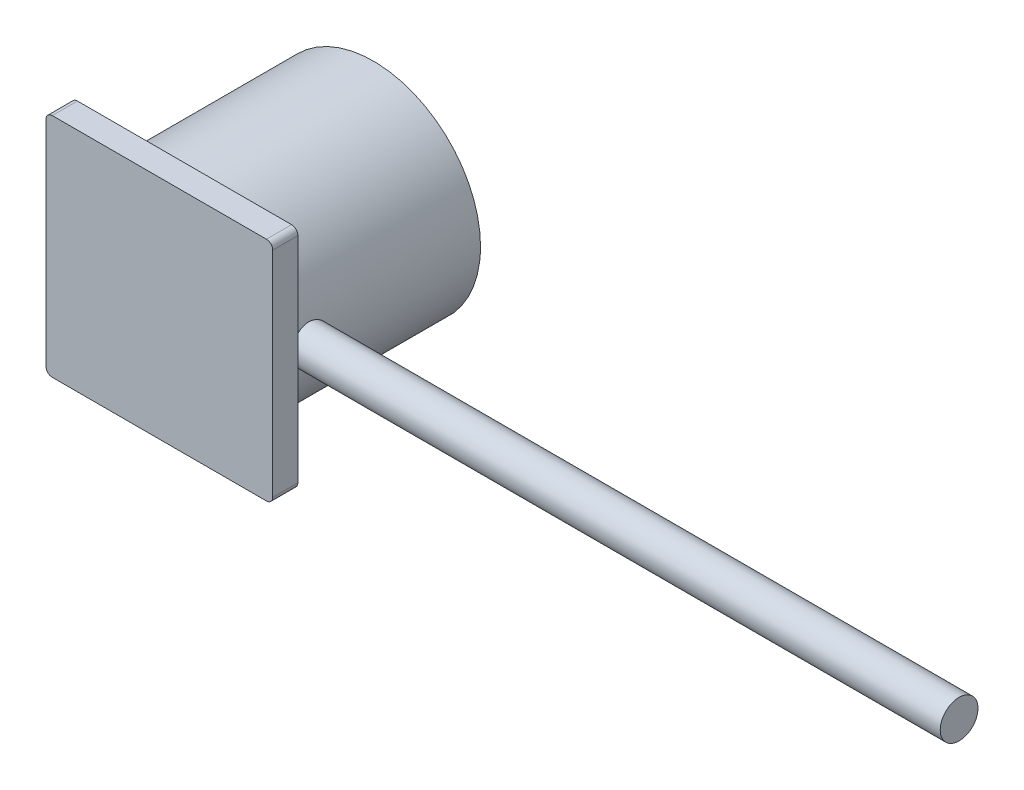
ISO-10303-21;
HEADER;
FILE_DESCRIPTION(('STEP AP214'),'2;1');
FILE_NAME('part.step','',(''),(''),'','','');
FILE_SCHEMA(('AUTOMOTIVE_DESIGN { 1 0 10303 214 1 1 1 1 }'));
ENDSEC;
DATA;
#1=APPLICATION_CONTEXT('core data for automotive mechanical design processes');
#2=APPLICATION_PROTOCOL_DEFINITION('international standard','automotive_design',2000,#1);
#3=PRODUCT_CONTEXT('',#1,'mechanical');
#4=PRODUCT('Part','Part','',(#3));
#5=PRODUCT_RELATED_PRODUCT_CATEGORY('part','',(#4));
#6=PRODUCT_DEFINITION_FORMATION('','',#4);
#7=PRODUCT_DEFINITION_CONTEXT('part definition',#1,'design');
#8=PRODUCT_DEFINITION('design','',#6,#7);
#9=PRODUCT_DEFINITION_SHAPE('','',#8);
#10=(LENGTH_UNIT() NAMED_UNIT(*) SI_UNIT(.MILLI.,.METRE.));
#11=(NAMED_UNIT(*) PLANE_ANGLE_UNIT() SI_UNIT($,.RADIAN.));
#12=(NAMED_UNIT(*) SI_UNIT($,.STERADIAN.) SOLID_ANGLE_UNIT());
#13=UNCERTAINTY_MEASURE_WITH_UNIT(LENGTH_MEASURE(1.E-05),#10,'distance_accuracy_value','');
#14=(GEOMETRIC_REPRESENTATION_CONTEXT(3) GLOBAL_UNCERTAINTY_ASSIGNED_CONTEXT((#13)) GLOBAL_UNIT_ASSIGNED_CONTEXT((#10,
#11,#12)) REPRESENTATION_CONTEXT('',''));
#15=CARTESIAN_POINT('',(0.,0.,0.));
#16=DIRECTION('',(0.,0.,1.));
#17=DIRECTION('',(1.,0.,0.));
#18=AXIS2_PLACEMENT_3D('',#15,#16,#17);
#19=CARTESIAN_POINT('',(0.,0.,150.));
#20=DIRECTION('',(0.,0.,-1.));
#21=DIRECTION('',(-1.,0.,0.));
#22=AXIS2_PLACEMENT_3D('',#19,#20,#21);
#23=CYLINDRICAL_SURFACE('',#22,85.);
#24=CARTESIAN_POINT('',(0.,0.,0.));
#25=DIRECTION('',(0.,0.,1.));
#26=DIRECTION('',(1.,0.,0.));
#27=AXIS2_PLACEMENT_3D('',#24,#25,#26);
#28=CIRCLE('',#27,85.);
#29=CARTESIAN_POINT('',(85.,0.,0.));
#30=VERTEX_POINT('',#29);
#31=EDGE_CURVE('E235',#30,#30,#28,.T.);
#32=ORIENTED_EDGE('',*,*,#31,.T.);
#33=EDGE_LOOP('',(#32));
#34=FACE_BOUND('',#33,.T.);
#35=CARTESIAN_POINT('',(84.2614977317636,-11.180339887499,145.));
#36=CARTESIAN_POINT('',(84.2243502648307,-11.4602820952851,144.68707508331));
#37=CARTESIAN_POINT('',(84.1875371233924,-11.7270459157408,144.36232298303));
#38=CARTESIAN_POINT('',(84.1155819518153,-12.232505619782,143.691482438714));
#39=CARTESIAN_POINT('',(84.0804399494977,-12.4712010361824,143.345393639685));
#40=CARTESIAN_POINT('',(84.0128345715087,-12.9187784992153,142.634247757288));
#41=CARTESIAN_POINT('',(83.9803708989801,-13.1276638517754,142.269192783398));
#42=CARTESIAN_POINT('',(83.9190443376802,-13.5141522129803,141.522603211806));
#43=CARTESIAN_POINT('',(83.8901813457556,-13.6917561178451,141.141069086626));
#44=CARTESIAN_POINT('',(83.8368666943744,-14.0145131329188,140.363827450858));
#45=CARTESIAN_POINT('',(83.812418820782,-14.1596384187133,139.968108121927));
#46=CARTESIAN_POINT('',(83.7686800101181,-14.4161435422095,139.165603353806));
#47=CARTESIAN_POINT('',(83.7493890135797,-14.5275237690472,138.758818042283));
#48=CARTESIAN_POINT('',(83.716540748055,-14.7156355859421,137.93727268097));
#49=CARTESIAN_POINT('',(83.7029809537239,-14.7923824375451,137.522516227913));
#50=CARTESIAN_POINT('',(83.6819864347215,-14.9106930324668,136.687864707694));
#51=CARTESIAN_POINT('',(83.674551621688,-14.9522572833489,136.267969714753));
#52=CARTESIAN_POINT('',(83.6660727531393,-14.9996280320312,135.43043682073));
#53=CARTESIAN_POINT('',(83.664963799073,-15.0057976558218,135.012820077559));
#54=CARTESIAN_POINT('',(83.6689953081647,-14.9833025224523,134.178557329718));
#55=CARTESIAN_POINT('',(83.6741357410667,-14.9546379339401,133.761911320358));
#56=CARTESIAN_POINT('',(83.6905167637252,-14.8626907930116,132.932501349713));
#57=CARTESIAN_POINT('',(83.7017584896061,-14.7994017931505,132.51973812601));
#58=CARTESIAN_POINT('',(83.7300143507846,-14.6386933138599,131.701113453106));
#59=CARTESIAN_POINT('',(83.74702848842,-14.5412738206075,131.295252006699));
#60=CARTESIAN_POINT('',(83.7862581015891,-14.3134984829811,130.494868703076));
#61=CARTESIAN_POINT('',(83.8084528874375,-14.1832734924245,130.100308571693));
#62=CARTESIAN_POINT('',(83.8574463307012,-13.8906688630187,129.323597601982));
#63=CARTESIAN_POINT('',(83.8842449698431,-13.7282893517952,128.941446714408));
#64=CARTESIAN_POINT('',(83.941689234473,-13.3725558093642,128.192155516565));
#65=CARTESIAN_POINT('',(83.9723348075703,-13.1792021999785,127.825015001963));
#66=CARTESIAN_POINT('',(84.03661749329,-12.7628861270812,127.108198571226));
#67=CARTESIAN_POINT('',(84.0702546390164,-12.539923335909,126.758522848419));
#68=CARTESIAN_POINT('',(84.1400213976509,-12.0629838898785,126.074736562434));
#69=CARTESIAN_POINT('',(84.1761767809472,-11.8086563948995,125.74087329764));
#70=CARTESIAN_POINT('',(84.2495850930538,-11.2729972972405,125.095691132604));
#71=CARTESIAN_POINT('',(84.2868380303223,-10.991665486421,124.784372406161));
#72=CARTESIAN_POINT('',(84.3614048615347,-10.4038987679683,124.186366307783));
#73=CARTESIAN_POINT('',(84.3987187602334,-10.0974618007446,123.899680960696));
#74=CARTESIAN_POINT('',(84.4723673620548,-9.46158398067294,123.35292956006));
#75=CARTESIAN_POINT('',(84.5087020613822,-9.13214303867903,123.092863609677));
#76=CARTESIAN_POINT('',(84.5797166956231,-8.44928614313204,122.598838148285));
#77=CARTESIAN_POINT('',(84.6143778343107,-8.09567369890738,122.365147426954));
#78=CARTESIAN_POINT('',(84.6806936372335,-7.36973206509877,121.928409323257));
#79=CARTESIAN_POINT('',(84.7123482784888,-6.99740273248704,121.725362175105));
#80=CARTESIAN_POINT('',(84.7717504901724,-6.23665427105194,121.351418566625));
#81=CARTESIAN_POINT('',(84.7994982521239,-5.84823593215339,121.180520530144));
#82=CARTESIAN_POINT('',(84.8502966780626,-5.05805033525885,120.872155450313));
#83=CARTESIAN_POINT('',(84.8733473893846,-4.65628321183334,120.734688070061));
#84=CARTESIAN_POINT('',(84.9139299204208,-3.84550920256943,120.495196584582));
#85=CARTESIAN_POINT('',(84.9315039263768,-3.43658465261446,120.39290089163));
#86=CARTESIAN_POINT('',(84.9608801338204,-2.61137685047029,120.223053068771));
#87=CARTESIAN_POINT('',(84.9726823597449,-2.19509362944443,120.155500791766));
#88=CARTESIAN_POINT('',(84.9901781660366,-1.3582205867121,120.055676504367));
#89=CARTESIAN_POINT('',(84.9958721863694,-0.937631077384963,120.023401952964));
#90=CARTESIAN_POINT('',(85.0009903659334,-0.0951914502545274,119.994382024426));
#91=CARTESIAN_POINT('',(85.0004145769383,0.326658657110456,119.997636353905));
#92=CARTESIAN_POINT('',(84.9930569998611,1.16319011650476,120.039380165901));
#93=CARTESIAN_POINT('',(84.9863539715374,1.5778945563922,120.077422484732));
#94=CARTESIAN_POINT('',(84.9670394081968,2.4025675667008,120.187818036054));
#95=CARTESIAN_POINT('',(84.9544279288403,2.81253618169848,120.260170945322));
#96=CARTESIAN_POINT('',(84.9236463529725,3.62484514609412,120.438632464073));
#97=CARTESIAN_POINT('',(84.9054762349288,4.0271854659363,120.544741204315));
#98=CARTESIAN_POINT('',(84.8640794246162,4.82142861544407,120.789913361889));
#99=CARTESIAN_POINT('',(84.8408527030685,5.21333138465934,120.928976970038));
#100=CARTESIAN_POINT('',(84.7899303890267,5.98476792847333,121.239340140327));
#101=CARTESIAN_POINT('',(84.7622259566263,6.36427541316816,121.41070358244));
#102=CARTESIAN_POINT('',(84.7031422502361,7.10750912018951,121.784240523442));
#103=CARTESIAN_POINT('',(84.6717629768262,7.47123534500633,121.98641401747));
#104=CARTESIAN_POINT('',(84.6061848988879,8.18048542846789,122.420156418851));
#105=CARTESIAN_POINT('',(84.5719858750647,8.52600786795399,122.65172761325));
#106=CARTESIAN_POINT('',(84.5017026195511,9.1965161855485,123.142650288297));
#107=CARTESIAN_POINT('',(84.4656183681415,9.52150184876805,123.402002059552));
#108=CARTESIAN_POINT('',(84.3920487607259,10.1530571272205,123.950442639245));
#109=CARTESIAN_POINT('',(84.3545510052418,10.459314961505,124.239888910405));
#110=CARTESIAN_POINT('',(84.279679477626,11.0464124024598,124.843522205485));
#111=CARTESIAN_POINT('',(84.2423057066372,11.3272517754166,125.157709456838));
#112=CARTESIAN_POINT('',(84.1687337202524,11.8615774209675,125.808683409963));
#113=CARTESIAN_POINT('',(84.1325355311672,12.115063081648,126.145470617032));
#114=CARTESIAN_POINT('',(84.0623418748594,12.5928954413399,126.839336594571));
#115=CARTESIAN_POINT('',(84.0283464062526,12.8172421586623,127.19641535229));
#116=CARTESIAN_POINT('',(83.963382509722,13.2361456628192,127.930085170778));
#117=CARTESIAN_POINT('',(83.9324286096578,13.4305617740652,128.306757868736));
#118=CARTESIAN_POINT('',(83.8746278608502,13.7869289021081,129.075468900919));
#119=CARTESIAN_POINT('',(83.8477810316795,13.9488797641895,129.46750730836));
#120=CARTESIAN_POINT('',(83.7989873121482,14.2390797907234,130.264146372438));
#121=CARTESIAN_POINT('',(83.7770402171562,14.3673303626669,130.668746503645));
#122=CARTESIAN_POINT('',(83.7386988715232,14.5891396842675,131.487603681305));
#123=CARTESIAN_POINT('',(83.7223045498706,14.6826988775767,131.901860604188));
#124=CARTESIAN_POINT('',(83.6957209954603,14.8334784362108,132.7320139405));
#125=CARTESIAN_POINT('',(83.6854599930975,14.891119455054,133.147831684589));
#126=CARTESIAN_POINT('',(83.6711426899947,14.9713576421106,133.982941656299));
#127=CARTESIAN_POINT('',(83.667086359989,14.993954975615,134.402233867522));
#128=CARTESIAN_POINT('',(83.6652988123753,15.003926168065,135.241217551723));
#129=CARTESIAN_POINT('',(83.6675671077475,14.9913027391395,135.660908991471));
#130=CARTESIAN_POINT('',(83.6783604447819,14.9309386807801,136.497671191926));
#131=CARTESIAN_POINT('',(83.6868853852342,14.8831986194058,136.914741994916));
#132=CARTESIAN_POINT('',(83.709826640145,14.7536163881793,137.739203947429));
#133=CARTESIAN_POINT('',(83.7241846088116,14.6721117986565,138.146649849807));
#134=CARTESIAN_POINT('',(83.7583744372901,14.4756568186879,138.953180051648));
#135=CARTESIAN_POINT('',(83.778206517317,14.3607050827055,139.352264014029));
#136=CARTESIAN_POINT('',(83.8227730594951,14.0982415755575,140.139224546792));
#137=CARTESIAN_POINT('',(83.8475068729375,13.9507341126126,140.527102592423));
#138=CARTESIAN_POINT('',(83.9011764931246,13.624240574006,141.289020758762));
#139=CARTESIAN_POINT('',(83.930111550124,13.4452601137501,141.663063333609));
#140=CARTESIAN_POINT('',(83.9831464742596,13.1092232193263,142.296583071509));
#141=CARTESIAN_POINT('',(84.006460496966,12.9591701143637,142.559870795327));
#142=CARTESIAN_POINT('',(84.0545549260294,12.6434683237668,143.076781819873));
#143=CARTESIAN_POINT('',(84.0793352466078,12.4778205500873,143.330405684513));
#144=CARTESIAN_POINT('',(84.1299576807621,12.1318070975092,143.826698596577));
#145=CARTESIAN_POINT('',(84.1557980800734,11.951464749057,144.069384094541));
#146=CARTESIAN_POINT('',(84.2082016541217,11.5764674487016,144.543418126702));
#147=CARTESIAN_POINT('',(84.2347649495243,11.3818100979989,144.774764749943));
#148=CARTESIAN_POINT('',(84.2614977317636,11.180339887499,145.));
#149=B_SPLINE_CURVE_WITH_KNOTS('',3,(#35,#36,#37,#38,#39,#40,#41,#42,#43,#44,#45,#46,#47,#48,
#49,#50,#51,#52,#53,#54,#55,#56,#57,#58,#59,#60,#61,#62,#63,#64,#65,#66,#67,#68,#69,#70,#71,#72,
#73,#74,#75,#76,#77,#78,#79,#80,#81,#82,#83,#84,#85,#86,#87,#88,#89,#90,#91,#92,#93,#94,#95,#96,
#97,#98,#99,#100,#101,#102,#103,#104,#105,#106,#107,#108,#109,#110,#111,#112,#113,#114,#115,
#116,#117,#118,#119,#120,#121,#122,#123,#124,#125,#126,#127,#128,#129,#130,#131,#132,#133,#134,
#135,#136,#137,#138,#139,#140,#141,#142,#143,#144,#145,#146,#147,#148),.UNSPECIFIED.,.F.,.F.,(4,
2,2,2,2,2,2,2,2,2,2,2,2,2,2,2,2,2,2,2,2,2,2,2,2,2,2,2,2,2,2,2,2,2,2,2,2,2,2,2,2,2,2,2,2,2,2,2,2,
2,2,2,2,2,2,2,4),(0.,1.26415727154783,2.52833558140393,3.79237358511859,5.05637536799343,
6.32145591014463,7.58652186327819,8.85102980668294,10.1155195072899,11.3670128356837,
12.6185001050624,13.870220494445,15.1219413907739,16.3687463918061,17.6155464441911,
18.862329518433,20.1091263909602,21.3714105054287,22.6337043499094,23.896101855035,
25.1585042525271,26.4327899179916,27.7070853225712,28.9813182368259,30.2555383093024,
31.5196857165684,32.7838277715583,34.0478787660292,35.3119193224371,36.559936901633,
37.8079427241283,39.0559533810289,40.3039712643616,41.5544837778076,42.8049960939196,
44.0556057555673,45.3062285009426,46.5739153604432,47.8416138746811,49.1093407419757,
50.377066812618,51.6505804248325,52.9241001059186,54.197566590059,55.4710167878671,
56.7292580305215,57.9874933383996,59.2456317601781,60.5037498302916,61.7495816241906,
62.995463543258,64.2411806888702,65.4866757989755,66.3979767332305,67.309224408918,
68.2190524885678,69.1290333792433),.UNSPECIFIED.);
#150=CARTESIAN_POINT('',(84.2614977317636,-11.180339887499,145.));
#151=VERTEX_POINT('',#150);
#152=CARTESIAN_POINT('',(84.2614977317636,11.1803398874989,145.));
#153=VERTEX_POINT('',#152);
#154=EDGE_CURVE('E134',#151,#153,#149,.T.);
#155=ORIENTED_EDGE('',*,*,#154,.F.);
#156=CARTESIAN_POINT('',(0.,0.,145.));
#157=DIRECTION('',(0.,0.,1.));
#158=DIRECTION('',(1.,0.,0.));
#159=AXIS2_PLACEMENT_3D('',#156,#157,#158);
#160=CIRCLE('',#159,85.);
#161=EDGE_CURVE('E123',#151,#153,#160,.F.);
#162=ORIENTED_EDGE('',*,*,#161,.T.);
#163=EDGE_LOOP('',(#155,#162));
#164=FACE_BOUND('',#163,.T.);
#165=ADVANCED_FACE('F37',(#34,#164),#23,.T.);
#166=CARTESIAN_POINT('',(0.,0.,145.));
#167=DIRECTION('',(0.,0.,1.));
#168=DIRECTION('',(1.,0.,0.));
#169=AXIS2_PLACEMENT_3D('',#166,#167,#168);
#170=TOROIDAL_SURFACE('',#169,90.,5.);
#171=CARTESIAN_POINT('',(84.2384918370588,11.3991841795806,144.7498));
#172=CARTESIAN_POINT('',(84.2490542330357,11.2611279901154,144.911243281545));
#173=CARTESIAN_POINT('',(84.2676968465338,11.1199763887562,145.069301107561));
#174=CARTESIAN_POINT('',(84.3190404690631,10.8325444204726,145.377870598457));
#175=CARTESIAN_POINT('',(84.3517192711645,10.6862724888856,145.528393765801));
#176=CARTESIAN_POINT('',(84.4287575489095,10.3904578310326,145.820410439822));
#177=CARTESIAN_POINT('',(84.4730175218569,10.240952469856,145.961968684328));
#178=CARTESIAN_POINT('',(84.5716869224767,9.93805582748024,146.237302117896));
#179=CARTESIAN_POINT('',(84.6261021233648,9.78466237899549,146.37107282273));
#180=CARTESIAN_POINT('',(84.7868703676076,9.36033061030703,146.726360138649));
#181=CARTESIAN_POINT('',(84.901960284467,9.08602138746411,146.939944761777));
#182=CARTESIAN_POINT('',(85.1520549911557,8.5294167286597,147.343719296621));
#183=CARTESIAN_POINT('',(85.2870690819056,8.24711761290202,147.533898205724));
#184=CARTESIAN_POINT('',(85.573291678194,7.67402681378953,147.892803609269));
#185=CARTESIAN_POINT('',(85.7246048641352,7.38319017549667,148.061374090342));
#186=CARTESIAN_POINT('',(86.038927519859,6.7959956648478,148.376301467566));
#187=CARTESIAN_POINT('',(86.2019362634351,6.49963813614225,148.522659741174));
#188=CARTESIAN_POINT('',(86.6127326880929,5.76650202527856,148.855507072729));
#189=CARTESIAN_POINT('',(86.8654255097988,5.32702738931784,149.030069580218));
#190=CARTESIAN_POINT('',(87.3824407430498,4.43966636510454,149.335608504698));
#191=CARTESIAN_POINT('',(87.6467695554258,3.99177542677248,149.466560584111));
#192=CARTESIAN_POINT('',(88.1806250298363,3.09069626141493,149.68543071941));
#193=CARTESIAN_POINT('',(88.4501325767878,2.63752930592687,149.773483764766));
#194=CARTESIAN_POINT('',(88.9903896779199,1.7260872079549,149.907467215901));
#195=CARTESIAN_POINT('',(89.2611382111738,1.26781593220289,149.953427568159));
#196=CARTESIAN_POINT('',(89.6069056857392,0.676899883788194,149.985291326513));
#197=CARTESIAN_POINT('',(89.6833253723366,0.545940073191169,149.990635428268));
#198=CARTESIAN_POINT('',(89.8358190489435,0.283763993360856,149.997888896259));
#199=CARTESIAN_POINT('',(89.9118931346025,0.152547811534755,149.999799278927));
#200=CARTESIAN_POINT('',(89.9918344176367,0.0141417605667712,149.999994999763));
#201=CARTESIAN_POINT('',(89.9959175268945,0.00707105126795888,149.999999999716));
#202=CARTESIAN_POINT('',(90.,0.,150.));
#203=B_SPLINE_CURVE_WITH_KNOTS('',3,(#171,#172,#173,#174,#175,#176,#177,#178,#179,#180,#181,
#182,#183,#184,#185,#186,#187,#188,#189,#190,#191,#192,#193,#194,#195,#196,#197,#198,#199,#200,
#201,#202),.UNSPECIFIED.,.F.,.F.,(4,2,2,2,2,2,2,2,2,2,2,2,2,2,2,4),(0.,0.637622516074735,
1.2742399315552,1.90555770160355,2.53723547323334,3.63411677935434,4.73151175639944,
5.83643030482371,6.94128030536056,8.54748371959438,10.1545820081065,11.756590077427,
13.3574575246643,13.8125978870377,14.2676034988968,14.2920984010117),.UNSPECIFIED.);
#204=CARTESIAN_POINT('',(90.,0.,150.));
#205=VERTEX_POINT('',#204);
#206=EDGE_CURVE('E11',#153,#205,#203,.T.);
#207=ORIENTED_EDGE('',*,*,#206,.F.);
#208=ORIENTED_EDGE('',*,*,#161,.F.);
#209=CARTESIAN_POINT('',(90.,0.,150.));
#210=CARTESIAN_POINT('',(89.9959175450131,-0.00707102053298209,149.999999996927));
#211=CARTESIAN_POINT('',(89.991834435921,-0.0141417295529932,149.999994997095));
#212=CARTESIAN_POINT('',(89.7077638334356,-0.505966294092986,149.999299693615));
#213=CARTESIAN_POINT('',(89.4247403373335,-0.989239523831884,149.975131253884));
#214=CARTESIAN_POINT('',(88.8575880973824,-1.95096774851285,149.880440781846));
#215=CARTESIAN_POINT('',(88.5734585980726,-2.42941811030266,149.80987782307));
#216=CARTESIAN_POINT('',(88.0084765714733,-3.38111378642554,149.622038885724));
#217=CARTESIAN_POINT('',(87.7276366455177,-3.85433883383383,149.504621426594));
#218=CARTESIAN_POINT('',(87.176090797318,-4.79221943279486,149.222317677253));
#219=CARTESIAN_POINT('',(86.9053785062496,-5.25688027343909,149.057461805902));
#220=CARTESIAN_POINT('',(86.4848001451892,-5.994363498475,148.753472490743));
#221=CARTESIAN_POINT('',(86.3294138900595,-6.27050823228326,148.629873559824));
#222=CARTESIAN_POINT('',(86.0270586971268,-6.81844719596523,148.364185894164));
#223=CARTESIAN_POINT('',(85.8800877952519,-7.09024243021742,148.222101499315));
#224=CARTESIAN_POINT('',(85.5978562441393,-7.62724821065727,147.919732263296));
#225=CARTESIAN_POINT('',(85.4625316337506,-7.89248814081508,147.759559724254));
#226=CARTESIAN_POINT('',(85.2056553228707,-8.41722030024244,147.419666049438));
#227=CARTESIAN_POINT('',(85.0841055037836,-8.67671174048062,147.239942249846));
#228=CARTESIAN_POINT('',(84.8756067424816,-9.15033760347725,146.888849323536));
#229=CARTESIAN_POINT('',(84.7862019928837,-9.36544671815203,146.720257166867));
#230=CARTESIAN_POINT('',(84.6232870547531,-9.78948072615661,146.368457712871));
#231=CARTESIAN_POINT('',(84.5497630644327,-9.99841085214662,146.185263297342));
#232=CARTESIAN_POINT('',(84.4537763217596,-10.3075055804394,145.898414456136));
#233=CARTESIAN_POINT('',(84.4240246291077,-10.4104464262653,145.80013949104));
#234=CARTESIAN_POINT('',(84.3701164673261,-10.6142171277339,145.59994280887));
#235=CARTESIAN_POINT('',(84.3459592027527,-10.7150472816286,145.498021612616));
#236=CARTESIAN_POINT('',(84.3037954499764,-10.914646699455,145.29034865662));
#237=CARTESIAN_POINT('',(84.2858067917354,-11.0134092272309,145.184586753898));
#238=CARTESIAN_POINT('',(84.2567654514191,-11.2083344191454,144.969671093218));
#239=CARTESIAN_POINT('',(84.2457164262168,-11.3044956870418,144.860515578721));
#240=CARTESIAN_POINT('',(84.2384918370584,-11.3991841795805,144.7498));
#241=B_SPLINE_CURVE_WITH_KNOTS('',3,(#209,#210,#211,#212,#213,#214,#215,#216,#217,#218,#219,
#220,#221,#222,#223,#224,#225,#226,#227,#228,#229,#230,#231,#232,#233,#234,#235,#236,#237,#238,
#239,#240),.UNSPECIFIED.,.F.,.F.,(4,2,2,2,2,2,2,2,2,2,2,2,2,2,2,4),(0.,0.0244949021149169,
1.70389296835687,3.38477449030614,5.07077043508049,6.75568767120342,7.77549427433025,
8.79506188487795,9.80861540398589,10.8223071909819,11.6842484688137,12.5454376019436,
12.9814865233851,13.4174734070959,13.8547100656072,14.2921769351943),.UNSPECIFIED.);
#242=EDGE_CURVE('E50',#205,#151,#241,.T.);
#243=ORIENTED_EDGE('',*,*,#242,.F.);
#244=CARTESIAN_POINT('',(0.,0.,150.));
#245=DIRECTION('',(0.,0.,1.));
#246=DIRECTION('',(1.,0.,0.));
#247=AXIS2_PLACEMENT_3D('',#244,#245,#246);
#248=CIRCLE('',#247,90.);
#249=CARTESIAN_POINT('',(0.,-90.,150.));
#250=VERTEX_POINT('',#249);
#251=EDGE_CURVE('E238',#250,#205,#248,.T.);
#252=ORIENTED_EDGE('',*,*,#251,.F.);
#253=CARTESIAN_POINT('',(0.,0.,150.));
#254=DIRECTION('',(0.,0.,1.));
#255=DIRECTION('',(1.,0.,0.));
#256=AXIS2_PLACEMENT_3D('',#253,#254,#255);
#257=CIRCLE('',#256,90.);
#258=CARTESIAN_POINT('',(-90.,0.,150.));
#259=VERTEX_POINT('',#258);
#260=EDGE_CURVE('E219',#259,#250,#257,.T.);
#261=ORIENTED_EDGE('',*,*,#260,.F.);
#262=CARTESIAN_POINT('',(0.,0.,150.));
#263=DIRECTION('',(0.,0.,1.));
#264=DIRECTION('',(1.,0.,0.));
#265=AXIS2_PLACEMENT_3D('',#262,#263,#264);
#266=CIRCLE('',#265,90.);
#267=CARTESIAN_POINT('',(0.,90.,150.));
#268=VERTEX_POINT('',#267);
#269=EDGE_CURVE('E243',#268,#259,#266,.T.);
#270=ORIENTED_EDGE('',*,*,#269,.F.);
#271=CARTESIAN_POINT('',(0.,0.,150.));
#272=DIRECTION('',(0.,0.,1.));
#273=DIRECTION('',(1.,0.,0.));
#274=AXIS2_PLACEMENT_3D('',#271,#272,#273);
#275=CIRCLE('',#274,90.);
#276=EDGE_CURVE('E132',#205,#268,#275,.T.);
#277=ORIENTED_EDGE('',*,*,#276,.F.);
#278=EDGE_LOOP('',(#207,#208,#243,#252,#261,#270,#277));
#279=FACE_BOUND('',#278,.T.);
#280=ADVANCED_FACE('F125',(#279),#170,.F.);
#281=CARTESIAN_POINT('',(0.,0.,150.));
#282=DIRECTION('',(0.,0.,1.));
#283=DIRECTION('',(1.,0.,0.));
#284=AXIS2_PLACEMENT_3D('',#281,#282,#283);
#285=PLANE('',#284);
#286=DIRECTION('',(-1.,0.,0.));
#287=VECTOR('',#286,1.);
#288=CARTESIAN_POINT('',(-90.,90.,150.));
#289=LINE('',#288,#287);
#290=CARTESIAN_POINT('',(84.9999999999999,90.,150.));
#291=VERTEX_POINT('',#290);
#292=EDGE_CURVE('E233',#291,#268,#289,.T.);
#293=ORIENTED_EDGE('',*,*,#292,.F.);
#294=CARTESIAN_POINT('',(85.,85.,150.));
#295=DIRECTION('',(0.,0.,1.));
#296=DIRECTION('',(1.,0.,0.));
#297=AXIS2_PLACEMENT_3D('',#294,#295,#296);
#298=CIRCLE('',#297,5.);
#299=CARTESIAN_POINT('',(90.,85.,150.));
#300=VERTEX_POINT('',#299);
#301=EDGE_CURVE('E267',#291,#300,#298,.F.);
#302=ORIENTED_EDGE('',*,*,#301,.T.);
#303=DIRECTION('',(0.,1.,0.));
#304=VECTOR('',#303,1.);
#305=CARTESIAN_POINT('',(90.,90.,150.));
#306=LINE('',#305,#304);
#307=EDGE_CURVE('E222',#205,#300,#306,.T.);
#308=ORIENTED_EDGE('',*,*,#307,.F.);
#309=ORIENTED_EDGE('',*,*,#276,.T.);
#310=EDGE_LOOP('',(#293,#302,#308,#309));
#311=FACE_BOUND('',#310,.T.);
#312=ADVANCED_FACE('F193',(#311),#285,.F.);
#313=DIRECTION('',(0.,-1.,0.));
#314=VECTOR('',#313,1.);
#315=CARTESIAN_POINT('',(-90.,90.,150.));
#316=LINE('',#315,#314);
#317=CARTESIAN_POINT('',(-90.,85.,150.));
#318=VERTEX_POINT('',#317);
#319=EDGE_CURVE('E228',#318,#259,#316,.T.);
#320=ORIENTED_EDGE('',*,*,#319,.F.);
#321=CARTESIAN_POINT('',(-85.,85.,150.));
#322=DIRECTION('',(0.,0.,1.));
#323=DIRECTION('',(1.,0.,0.));
#324=AXIS2_PLACEMENT_3D('',#321,#322,#323);
#325=CIRCLE('',#324,5.);
#326=CARTESIAN_POINT('',(-85.,90.,150.));
#327=VERTEX_POINT('',#326);
#328=EDGE_CURVE('E250',#318,#327,#325,.F.);
#329=ORIENTED_EDGE('',*,*,#328,.T.);
#330=EDGE_CURVE('E232',#268,#327,#289,.T.);
#331=ORIENTED_EDGE('',*,*,#330,.F.);
#332=ORIENTED_EDGE('',*,*,#269,.T.);
#333=EDGE_LOOP('',(#320,#329,#331,#332));
#334=FACE_BOUND('',#333,.T.);
#335=ADVANCED_FACE('F204',(#334),#285,.F.);
#336=DIRECTION('',(1.,0.,0.));
#337=VECTOR('',#336,1.);
#338=CARTESIAN_POINT('',(-89.9999999999999,-90.,150.));
#339=LINE('',#338,#337);
#340=CARTESIAN_POINT('',(-84.9999999999999,-90.,150.));
#341=VERTEX_POINT('',#340);
#342=EDGE_CURVE('E214',#341,#250,#339,.T.);
#343=ORIENTED_EDGE('',*,*,#342,.F.);
#344=CARTESIAN_POINT('',(-84.9999999999999,-85.,150.));
#345=DIRECTION('',(0.,0.,1.));
#346=DIRECTION('',(1.,0.,0.));
#347=AXIS2_PLACEMENT_3D('',#344,#345,#346);
#348=CIRCLE('',#347,5.);
#349=CARTESIAN_POINT('',(-89.9999999999999,-85.,150.));
#350=VERTEX_POINT('',#349);
#351=EDGE_CURVE('E216',#341,#350,#348,.F.);
#352=ORIENTED_EDGE('',*,*,#351,.T.);
#353=EDGE_CURVE('E136',#259,#350,#316,.T.);
#354=ORIENTED_EDGE('',*,*,#353,.F.);
#355=ORIENTED_EDGE('',*,*,#260,.T.);
#356=EDGE_LOOP('',(#343,#352,#354,#355));
#357=FACE_BOUND('',#356,.T.);
#358=ADVANCED_FACE('F174',(#357),#285,.F.);
#359=CARTESIAN_POINT('',(0.,0.,0.));
#360=DIRECTION('',(0.,0.,1.));
#361=DIRECTION('',(1.,0.,0.));
#362=AXIS2_PLACEMENT_3D('',#359,#360,#361);
#363=PLANE('',#362);
#364=ORIENTED_EDGE('',*,*,#31,.F.);
#365=EDGE_LOOP('',(#364));
#366=FACE_BOUND('',#365,.T.);
#367=ADVANCED_FACE('F170',(#366),#363,.F.);
#368=CARTESIAN_POINT('',(-90.,90.,170.));
#369=DIRECTION('',(1.,0.,0.));
#370=DIRECTION('',(0.,1.,0.));
#371=AXIS2_PLACEMENT_3D('',#368,#369,#370);
#372=PLANE('',#371);
#373=ORIENTED_EDGE('',*,*,#353,.T.);
#374=DIRECTION('',(0.,0.,-1.));
#375=VECTOR('',#374,1.);
#376=CARTESIAN_POINT('',(-89.9999999999999,-85.,170.));
#377=LINE('',#376,#375);
#378=CARTESIAN_POINT('',(-89.9999999999999,-85.,170.));
#379=VERTEX_POINT('',#378);
#380=EDGE_CURVE('E260',#350,#379,#377,.F.);
#381=ORIENTED_EDGE('',*,*,#380,.T.);
#382=DIRECTION('',(0.,-1.,0.));
#383=VECTOR('',#382,1.);
#384=CARTESIAN_POINT('',(-90.,90.,170.));
#385=LINE('',#384,#383);
#386=CARTESIAN_POINT('',(-90.,85.,170.));
#387=VERTEX_POINT('',#386);
#388=EDGE_CURVE('E164',#387,#379,#385,.T.);
#389=ORIENTED_EDGE('',*,*,#388,.F.);
#390=DIRECTION('',(0.,0.,-1.));
#391=VECTOR('',#390,1.);
#392=CARTESIAN_POINT('',(-90.,85.,170.));
#393=LINE('',#392,#391);
#394=EDGE_CURVE('E131',#387,#318,#393,.T.);
#395=ORIENTED_EDGE('',*,*,#394,.T.);
#396=ORIENTED_EDGE('',*,*,#319,.T.);
#397=EDGE_LOOP('',(#373,#381,#389,#395,#396));
#398=FACE_BOUND('',#397,.T.);
#399=ADVANCED_FACE('F173',(#398),#372,.F.);
#400=CARTESIAN_POINT('',(-89.9999999999999,-90.,170.));
#401=DIRECTION('',(0.,1.,0.));
#402=DIRECTION('',(-1.,0.,0.));
#403=AXIS2_PLACEMENT_3D('',#400,#401,#402);
#404=PLANE('',#403);
#405=CARTESIAN_POINT('',(84.9999999999999,-90.,150.));
#406=VERTEX_POINT('',#405);
#407=EDGE_CURVE('E223',#250,#406,#339,.T.);
#408=ORIENTED_EDGE('',*,*,#407,.T.);
#409=DIRECTION('',(0.,0.,-1.));
#410=VECTOR('',#409,1.);
#411=CARTESIAN_POINT('',(85.,-90.,170.));
#412=LINE('',#411,#410);
#413=CARTESIAN_POINT('',(84.9999999999999,-90.,170.));
#414=VERTEX_POINT('',#413);
#415=EDGE_CURVE('E63',#406,#414,#412,.F.);
#416=ORIENTED_EDGE('',*,*,#415,.T.);
#417=DIRECTION('',(1.,0.,0.));
#418=VECTOR('',#417,1.);
#419=CARTESIAN_POINT('',(-89.9999999999999,-90.,170.));
#420=LINE('',#419,#418);
#421=CARTESIAN_POINT('',(-84.9999999999999,-90.,170.));
#422=VERTEX_POINT('',#421);
#423=EDGE_CURVE('E283',#422,#414,#420,.T.);
#424=ORIENTED_EDGE('',*,*,#423,.F.);
#425=DIRECTION('',(0.,0.,-1.));
#426=VECTOR('',#425,1.);
#427=CARTESIAN_POINT('',(-84.9999999999999,-90.,170.));
#428=LINE('',#427,#426);
#429=EDGE_CURVE('E257',#422,#341,#428,.T.);
#430=ORIENTED_EDGE('',*,*,#429,.T.);
#431=ORIENTED_EDGE('',*,*,#342,.T.);
#432=EDGE_LOOP('',(#408,#416,#424,#430,#431));
#433=FACE_BOUND('',#432,.T.);
#434=ADVANCED_FACE('F178',(#433),#404,.F.);
#435=CARTESIAN_POINT('',(90.,90.,170.));
#436=DIRECTION('',(-1.,0.,0.));
#437=DIRECTION('',(0.,-1.,0.));
#438=AXIS2_PLACEMENT_3D('',#435,#436,#437);
#439=PLANE('',#438);
#440=DIRECTION('',(0.,1.,0.));
#441=VECTOR('',#440,1.);
#442=CARTESIAN_POINT('',(90.,90.,170.));
#443=LINE('',#442,#441);
#444=CARTESIAN_POINT('',(90.,-84.9999999999999,170.));
#445=VERTEX_POINT('',#444);
#446=CARTESIAN_POINT('',(90.,85.,170.));
#447=VERTEX_POINT('',#446);
#448=EDGE_CURVE('E282',#445,#447,#443,.T.);
#449=ORIENTED_EDGE('',*,*,#448,.F.);
#450=DIRECTION('',(0.,0.,-1.));
#451=VECTOR('',#450,1.);
#452=CARTESIAN_POINT('',(90.,-85.,170.));
#453=LINE('',#452,#451);
#454=CARTESIAN_POINT('',(90.,-84.9999999999999,150.));
#455=VERTEX_POINT('',#454);
#456=EDGE_CURVE('E274',#445,#455,#453,.T.);
#457=ORIENTED_EDGE('',*,*,#456,.T.);
#458=EDGE_CURVE('E226',#455,#205,#306,.T.);
#459=ORIENTED_EDGE('',*,*,#458,.T.);
#460=ORIENTED_EDGE('',*,*,#307,.T.);
#461=DIRECTION('',(0.,0.,-1.));
#462=VECTOR('',#461,1.);
#463=CARTESIAN_POINT('',(90.,85.,170.));
#464=LINE('',#463,#462);
#465=EDGE_CURVE('E269',#300,#447,#464,.F.);
#466=ORIENTED_EDGE('',*,*,#465,.T.);
#467=EDGE_LOOP('',(#449,#457,#459,#460,#466));
#468=FACE_BOUND('',#467,.T.);
#469=ADVANCED_FACE('F182',(#468),#439,.F.);
#470=CARTESIAN_POINT('',(-90.,90.,170.));
#471=DIRECTION('',(0.,-1.,0.));
#472=DIRECTION('',(1.,0.,0.));
#473=AXIS2_PLACEMENT_3D('',#470,#471,#472);
#474=PLANE('',#473);
#475=DIRECTION('',(-1.,0.,0.));
#476=VECTOR('',#475,1.);
#477=CARTESIAN_POINT('',(-90.,90.,170.));
#478=LINE('',#477,#476);
#479=CARTESIAN_POINT('',(84.9999999999999,90.,170.));
#480=VERTEX_POINT('',#479);
#481=CARTESIAN_POINT('',(-85.,90.,170.));
#482=VERTEX_POINT('',#481);
#483=EDGE_CURVE('E239',#480,#482,#478,.T.);
#484=ORIENTED_EDGE('',*,*,#483,.F.);
#485=DIRECTION('',(0.,0.,-1.));
#486=VECTOR('',#485,1.);
#487=CARTESIAN_POINT('',(85.,90.,170.));
#488=LINE('',#487,#486);
#489=EDGE_CURVE('E264',#480,#291,#488,.T.);
#490=ORIENTED_EDGE('',*,*,#489,.T.);
#491=ORIENTED_EDGE('',*,*,#292,.T.);
#492=ORIENTED_EDGE('',*,*,#330,.T.);
#493=DIRECTION('',(0.,0.,-1.));
#494=VECTOR('',#493,1.);
#495=CARTESIAN_POINT('',(-85.,90.,170.));
#496=LINE('',#495,#494);
#497=EDGE_CURVE('E252',#327,#482,#496,.F.);
#498=ORIENTED_EDGE('',*,*,#497,.T.);
#499=EDGE_LOOP('',(#484,#490,#491,#492,#498));
#500=FACE_BOUND('',#499,.T.);
#501=ADVANCED_FACE('F185',(#500),#474,.F.);
#502=CARTESIAN_POINT('',(0.,0.,170.));
#503=DIRECTION('',(0.,0.,1.));
#504=DIRECTION('',(1.,0.,0.));
#505=AXIS2_PLACEMENT_3D('',#502,#503,#504);
#506=PLANE('',#505);
#507=ORIENTED_EDGE('',*,*,#423,.T.);
#508=CARTESIAN_POINT('',(85.,-85.,170.));
#509=DIRECTION('',(0.,0.,1.));
#510=DIRECTION('',(1.,0.,0.));
#511=AXIS2_PLACEMENT_3D('',#508,#509,#510);
#512=CIRCLE('',#511,5.);
#513=EDGE_CURVE('E140',#414,#445,#512,.T.);
#514=ORIENTED_EDGE('',*,*,#513,.T.);
#515=ORIENTED_EDGE('',*,*,#448,.T.);
#516=CARTESIAN_POINT('',(85.,85.,170.));
#517=DIRECTION('',(0.,0.,1.));
#518=DIRECTION('',(1.,0.,0.));
#519=AXIS2_PLACEMENT_3D('',#516,#517,#518);
#520=CIRCLE('',#519,5.);
#521=EDGE_CURVE('E272',#447,#480,#520,.T.);
#522=ORIENTED_EDGE('',*,*,#521,.T.);
#523=ORIENTED_EDGE('',*,*,#483,.T.);
#524=CARTESIAN_POINT('',(-85.,85.,170.));
#525=DIRECTION('',(0.,0.,1.));
#526=DIRECTION('',(1.,0.,0.));
#527=AXIS2_PLACEMENT_3D('',#524,#525,#526);
#528=CIRCLE('',#527,5.);
#529=EDGE_CURVE('E255',#482,#387,#528,.T.);
#530=ORIENTED_EDGE('',*,*,#529,.T.);
#531=ORIENTED_EDGE('',*,*,#388,.T.);
#532=CARTESIAN_POINT('',(-84.9999999999999,-85.,170.));
#533=DIRECTION('',(0.,0.,1.));
#534=DIRECTION('',(1.,0.,0.));
#535=AXIS2_PLACEMENT_3D('',#532,#533,#534);
#536=CIRCLE('',#535,5.);
#537=EDGE_CURVE('E262',#379,#422,#536,.T.);
#538=ORIENTED_EDGE('',*,*,#537,.T.);
#539=EDGE_LOOP('',(#507,#514,#515,#522,#523,#530,#531,#538));
#540=FACE_BOUND('',#539,.T.);
#541=ADVANCED_FACE('F155',(#540),#506,.T.);
#542=ORIENTED_EDGE('',*,*,#458,.F.);
#543=CARTESIAN_POINT('',(85.,-85.,150.));
#544=DIRECTION('',(0.,0.,1.));
#545=DIRECTION('',(1.,0.,0.));
#546=AXIS2_PLACEMENT_3D('',#543,#544,#545);
#547=CIRCLE('',#546,5.);
#548=EDGE_CURVE('E277',#455,#406,#547,.F.);
#549=ORIENTED_EDGE('',*,*,#548,.T.);
#550=ORIENTED_EDGE('',*,*,#407,.F.);
#551=ORIENTED_EDGE('',*,*,#251,.T.);
#552=EDGE_LOOP('',(#542,#549,#550,#551));
#553=FACE_BOUND('',#552,.T.);
#554=ADVANCED_FACE('F189',(#553),#285,.F.);
#555=CARTESIAN_POINT('',(-85.,85.,170.));
#556=DIRECTION('',(0.,0.,-1.));
#557=DIRECTION('',(-1.,0.,0.));
#558=AXIS2_PLACEMENT_3D('',#555,#556,#557);
#559=CYLINDRICAL_SURFACE('',#558,5.);
#560=ORIENTED_EDGE('',*,*,#529,.F.);
#561=ORIENTED_EDGE('',*,*,#497,.F.);
#562=ORIENTED_EDGE('',*,*,#328,.F.);
#563=ORIENTED_EDGE('',*,*,#394,.F.);
#564=EDGE_LOOP('',(#560,#561,#562,#563));
#565=FACE_BOUND('',#564,.T.);
#566=ADVANCED_FACE('F191',(#565),#559,.T.);
#567=CARTESIAN_POINT('',(-84.9999999999999,-85.,170.));
#568=DIRECTION('',(0.,0.,-1.));
#569=DIRECTION('',(-1.,0.,0.));
#570=AXIS2_PLACEMENT_3D('',#567,#568,#569);
#571=CYLINDRICAL_SURFACE('',#570,5.);
#572=ORIENTED_EDGE('',*,*,#537,.F.);
#573=ORIENTED_EDGE('',*,*,#380,.F.);
#574=ORIENTED_EDGE('',*,*,#351,.F.);
#575=ORIENTED_EDGE('',*,*,#429,.F.);
#576=EDGE_LOOP('',(#572,#573,#574,#575));
#577=FACE_BOUND('',#576,.T.);
#578=ADVANCED_FACE('F198',(#577),#571,.T.);
#579=CARTESIAN_POINT('',(85.,85.,170.));
#580=DIRECTION('',(0.,0.,-1.));
#581=DIRECTION('',(-1.,0.,0.));
#582=AXIS2_PLACEMENT_3D('',#579,#580,#581);
#583=CYLINDRICAL_SURFACE('',#582,5.);
#584=ORIENTED_EDGE('',*,*,#521,.F.);
#585=ORIENTED_EDGE('',*,*,#465,.F.);
#586=ORIENTED_EDGE('',*,*,#301,.F.);
#587=ORIENTED_EDGE('',*,*,#489,.F.);
#588=EDGE_LOOP('',(#584,#585,#586,#587));
#589=FACE_BOUND('',#588,.T.);
#590=ADVANCED_FACE('F301',(#589),#583,.T.);
#591=CARTESIAN_POINT('',(85.,-85.,170.));
#592=DIRECTION('',(0.,0.,-1.));
#593=DIRECTION('',(-1.,0.,0.));
#594=AXIS2_PLACEMENT_3D('',#591,#592,#593);
#595=CYLINDRICAL_SURFACE('',#594,5.);
#596=ORIENTED_EDGE('',*,*,#513,.F.);
#597=ORIENTED_EDGE('',*,*,#415,.F.);
#598=ORIENTED_EDGE('',*,*,#548,.F.);
#599=ORIENTED_EDGE('',*,*,#456,.F.);
#600=EDGE_LOOP('',(#596,#597,#598,#599));
#601=FACE_BOUND('',#600,.T.);
#602=ADVANCED_FACE('F39',(#601),#595,.T.);
#603=CARTESIAN_POINT('',(600.,0.,135.));
#604=DIRECTION('',(-1.,0.,0.));
#605=DIRECTION('',(0.,0.,1.));
#606=AXIS2_PLACEMENT_3D('',#603,#604,#605);
#607=CYLINDRICAL_SURFACE('',#606,15.);
#608=CARTESIAN_POINT('',(600.,0.,135.));
#609=DIRECTION('',(1.,0.,0.));
#610=DIRECTION('',(0.,0.,-1.));
#611=AXIS2_PLACEMENT_3D('',#608,#609,#610);
#612=CIRCLE('',#611,15.);
#613=CARTESIAN_POINT('',(600.,0.,120.));
#614=VERTEX_POINT('',#613);
#615=EDGE_CURVE('E137',#614,#614,#612,.T.);
#616=ORIENTED_EDGE('',*,*,#615,.F.);
#617=EDGE_LOOP('',(#616));
#618=FACE_BOUND('',#617,.T.);
#619=ORIENTED_EDGE('',*,*,#242,.T.);
#620=ORIENTED_EDGE('',*,*,#154,.T.);
#621=ORIENTED_EDGE('',*,*,#206,.T.);
#622=EDGE_LOOP('',(#619,#620,#621));
#623=FACE_BOUND('',#622,.T.);
#624=ADVANCED_FACE('F139',(#618,#623),#607,.T.);
#625=CARTESIAN_POINT('',(600.,0.,135.));
#626=DIRECTION('',(1.,0.,0.));
#627=DIRECTION('',(0.,0.,-1.));
#628=AXIS2_PLACEMENT_3D('',#625,#626,#627);
#629=PLANE('',#628);
#630=ORIENTED_EDGE('',*,*,#615,.T.);
#631=EDGE_LOOP('',(#630));
#632=FACE_BOUND('',#631,.T.);
#633=ADVANCED_FACE('F153',(#632),#629,.T.);
#634=CLOSED_SHELL('',(#165,#280,#312,#335,#358,#367,#399,#434,#469,#501,#541,#554,#566,#578,
#590,#602,#624,#633));
#635=MANIFOLD_SOLID_BREP('B2',#634);
#636=ADVANCED_BREP_SHAPE_REPRESENTATION('',(#18,#635),#14);
#637=SHAPE_DEFINITION_REPRESENTATION(#9,#636);
ENDSEC;
END-ISO-10303-21;
